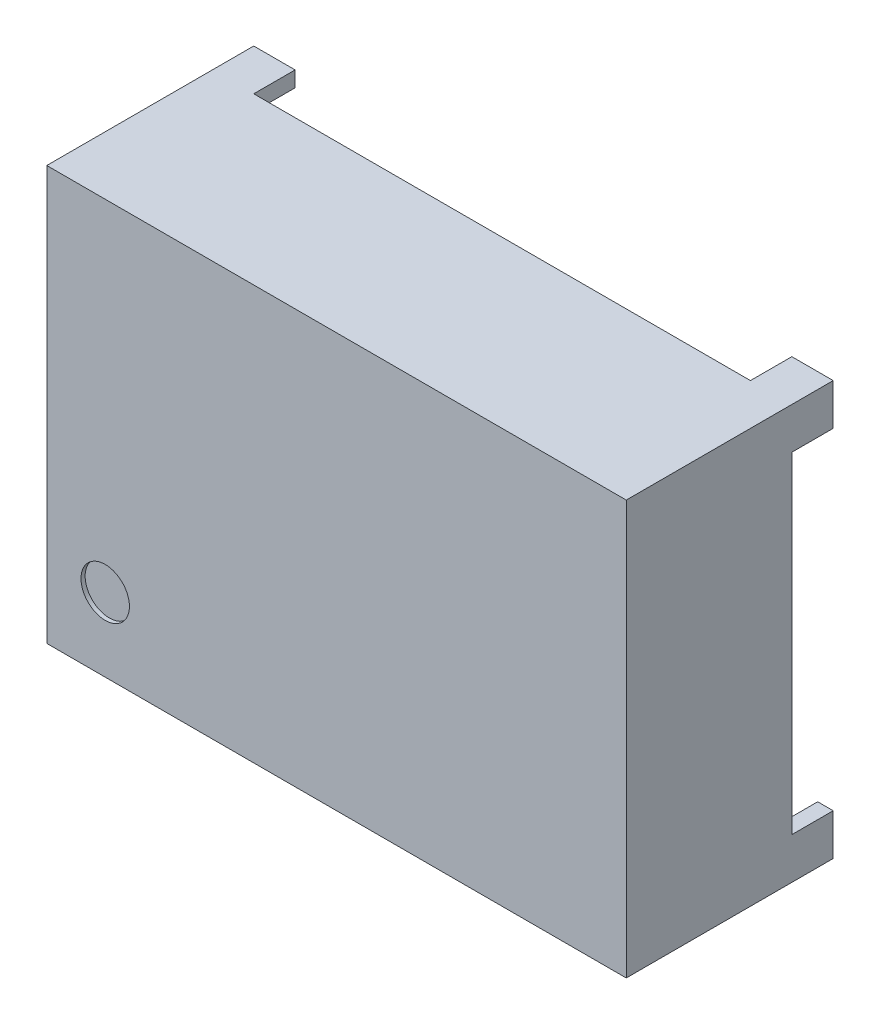
ISO-10303-21;
HEADER;
FILE_DESCRIPTION(('STEP AP214'),'2;1');
FILE_NAME('part.step','',(''),(''),'','','');
FILE_SCHEMA(('AUTOMOTIVE_DESIGN { 1 0 10303 214 1 1 1 1 }'));
ENDSEC;
DATA;
#1=APPLICATION_CONTEXT('core data for automotive mechanical design processes');
#2=APPLICATION_PROTOCOL_DEFINITION('international standard','automotive_design',2000,#1);
#3=PRODUCT_CONTEXT('',#1,'mechanical');
#4=PRODUCT('Part','Part','',(#3));
#5=PRODUCT_RELATED_PRODUCT_CATEGORY('part','',(#4));
#6=PRODUCT_DEFINITION_FORMATION('','',#4);
#7=PRODUCT_DEFINITION_CONTEXT('part definition',#1,'design');
#8=PRODUCT_DEFINITION('design','',#6,#7);
#9=PRODUCT_DEFINITION_SHAPE('','',#8);
#10=(LENGTH_UNIT() NAMED_UNIT(*) SI_UNIT(.MILLI.,.METRE.));
#11=(NAMED_UNIT(*) PLANE_ANGLE_UNIT() SI_UNIT($,.RADIAN.));
#12=(NAMED_UNIT(*) SI_UNIT($,.STERADIAN.) SOLID_ANGLE_UNIT());
#13=UNCERTAINTY_MEASURE_WITH_UNIT(LENGTH_MEASURE(1.E-05),#10,'distance_accuracy_value','');
#14=(GEOMETRIC_REPRESENTATION_CONTEXT(3) GLOBAL_UNCERTAINTY_ASSIGNED_CONTEXT((#13)) GLOBAL_UNIT_ASSIGNED_CONTEXT((#10,
#11,#12)) REPRESENTATION_CONTEXT('',''));
#15=CARTESIAN_POINT('',(0.,0.,0.));
#16=DIRECTION('',(0.,0.,1.));
#17=DIRECTION('',(1.,0.,0.));
#18=AXIS2_PLACEMENT_3D('',#15,#16,#17);
#19=CARTESIAN_POINT('',(-14.,-10.,0.));
#20=DIRECTION('',(0.,0.,1.));
#21=DIRECTION('',(1.,0.,0.));
#22=AXIS2_PLACEMENT_3D('',#19,#20,#21);
#23=PLANE('',#22);
#24=DIRECTION('',(1.,0.,0.));
#25=VECTOR('',#24,1.);
#26=CARTESIAN_POINT('',(-14.,-8.00000000000001,0.));
#27=LINE('',#26,#25);
#28=CARTESIAN_POINT('',(-14.,-8.00000000000001,0.));
#29=VERTEX_POINT('',#28);
#30=CARTESIAN_POINT('',(-13.25,-8.00000000000001,0.));
#31=VERTEX_POINT('',#30);
#32=EDGE_CURVE('E201',#29,#31,#27,.T.);
#33=ORIENTED_EDGE('',*,*,#32,.F.);
#34=DIRECTION('',(0.,-1.,0.));
#35=VECTOR('',#34,1.);
#36=CARTESIAN_POINT('',(-14.,10.,0.));
#37=LINE('',#36,#35);
#38=CARTESIAN_POINT('',(-14.,8.00000000000001,0.));
#39=VERTEX_POINT('',#38);
#40=EDGE_CURVE('E214',#39,#29,#37,.T.);
#41=ORIENTED_EDGE('',*,*,#40,.F.);
#42=DIRECTION('',(-1.,0.,0.));
#43=VECTOR('',#42,1.);
#44=CARTESIAN_POINT('',(-14.,8.00000000000001,0.));
#45=LINE('',#44,#43);
#46=CARTESIAN_POINT('',(-13.25,8.00000000000001,0.));
#47=VERTEX_POINT('',#46);
#48=EDGE_CURVE('E321',#47,#39,#45,.T.);
#49=ORIENTED_EDGE('',*,*,#48,.F.);
#50=DIRECTION('',(0.,-1.,0.));
#51=VECTOR('',#50,1.);
#52=CARTESIAN_POINT('',(-13.25,8.00000000000001,0.));
#53=LINE('',#52,#51);
#54=CARTESIAN_POINT('',(-13.25,9.25000000000001,0.));
#55=VERTEX_POINT('',#54);
#56=EDGE_CURVE('E323',#55,#47,#53,.T.);
#57=ORIENTED_EDGE('',*,*,#56,.F.);
#58=DIRECTION('',(-1.,0.,0.));
#59=VECTOR('',#58,1.);
#60=CARTESIAN_POINT('',(-13.25,9.25000000000001,0.));
#61=LINE('',#60,#59);
#62=CARTESIAN_POINT('',(-12.,9.25000000000001,0.));
#63=VERTEX_POINT('',#62);
#64=EDGE_CURVE('E325',#63,#55,#61,.T.);
#65=ORIENTED_EDGE('',*,*,#64,.F.);
#66=DIRECTION('',(0.,-1.,0.));
#67=VECTOR('',#66,1.);
#68=CARTESIAN_POINT('',(-12.,9.25000000000001,0.));
#69=LINE('',#68,#67);
#70=CARTESIAN_POINT('',(-12.,10.,0.));
#71=VERTEX_POINT('',#70);
#72=EDGE_CURVE('E327',#71,#63,#69,.T.);
#73=ORIENTED_EDGE('',*,*,#72,.F.);
#74=DIRECTION('',(-1.,0.,0.));
#75=VECTOR('',#74,1.);
#76=CARTESIAN_POINT('',(-14.,10.,0.));
#77=LINE('',#76,#75);
#78=CARTESIAN_POINT('',(12.,10.,0.));
#79=VERTEX_POINT('',#78);
#80=EDGE_CURVE('E239',#79,#71,#77,.T.);
#81=ORIENTED_EDGE('',*,*,#80,.F.);
#82=DIRECTION('',(0.,1.,0.));
#83=VECTOR('',#82,1.);
#84=CARTESIAN_POINT('',(12.,9.25000000000001,0.));
#85=LINE('',#84,#83);
#86=CARTESIAN_POINT('',(12.,9.25000000000001,0.));
#87=VERTEX_POINT('',#86);
#88=EDGE_CURVE('E252',#87,#79,#85,.T.);
#89=ORIENTED_EDGE('',*,*,#88,.F.);
#90=DIRECTION('',(-1.,0.,0.));
#91=VECTOR('',#90,1.);
#92=CARTESIAN_POINT('',(13.25,9.25000000000001,0.));
#93=LINE('',#92,#91);
#94=CARTESIAN_POINT('',(13.25,9.25000000000001,0.));
#95=VERTEX_POINT('',#94);
#96=EDGE_CURVE('E257',#95,#87,#93,.T.);
#97=ORIENTED_EDGE('',*,*,#96,.F.);
#98=DIRECTION('',(0.,1.,0.));
#99=VECTOR('',#98,1.);
#100=CARTESIAN_POINT('',(13.25,8.00000000000001,0.));
#101=LINE('',#100,#99);
#102=CARTESIAN_POINT('',(13.25,8.00000000000001,0.));
#103=VERTEX_POINT('',#102);
#104=EDGE_CURVE('E246',#103,#95,#101,.T.);
#105=ORIENTED_EDGE('',*,*,#104,.F.);
#106=DIRECTION('',(-1.,0.,0.));
#107=VECTOR('',#106,1.);
#108=CARTESIAN_POINT('',(14.,8.00000000000001,0.));
#109=LINE('',#108,#107);
#110=CARTESIAN_POINT('',(14.,8.00000000000001,0.));
#111=VERTEX_POINT('',#110);
#112=EDGE_CURVE('E243',#111,#103,#109,.T.);
#113=ORIENTED_EDGE('',*,*,#112,.F.);
#114=DIRECTION('',(0.,1.,0.));
#115=VECTOR('',#114,1.);
#116=CARTESIAN_POINT('',(14.,10.,0.));
#117=LINE('',#116,#115);
#118=CARTESIAN_POINT('',(14.,-8.00000000000001,0.));
#119=VERTEX_POINT('',#118);
#120=EDGE_CURVE('E36',#119,#111,#117,.T.);
#121=ORIENTED_EDGE('',*,*,#120,.F.);
#122=DIRECTION('',(1.,0.,0.));
#123=VECTOR('',#122,1.);
#124=CARTESIAN_POINT('',(14.,-8.00000000000001,0.));
#125=LINE('',#124,#123);
#126=CARTESIAN_POINT('',(13.25,-8.00000000000001,0.));
#127=VERTEX_POINT('',#126);
#128=EDGE_CURVE('E356',#127,#119,#125,.T.);
#129=ORIENTED_EDGE('',*,*,#128,.F.);
#130=DIRECTION('',(0.,1.,0.));
#131=VECTOR('',#130,1.);
#132=CARTESIAN_POINT('',(13.25,-8.00000000000001,0.));
#133=LINE('',#132,#131);
#134=CARTESIAN_POINT('',(13.25,-9.25000000000001,0.));
#135=VERTEX_POINT('',#134);
#136=EDGE_CURVE('E358',#135,#127,#133,.T.);
#137=ORIENTED_EDGE('',*,*,#136,.F.);
#138=DIRECTION('',(1.,0.,0.));
#139=VECTOR('',#138,1.);
#140=CARTESIAN_POINT('',(13.25,-9.25000000000001,0.));
#141=LINE('',#140,#139);
#142=CARTESIAN_POINT('',(12.,-9.25000000000001,0.));
#143=VERTEX_POINT('',#142);
#144=EDGE_CURVE('E360',#143,#135,#141,.T.);
#145=ORIENTED_EDGE('',*,*,#144,.F.);
#146=DIRECTION('',(0.,1.,0.));
#147=VECTOR('',#146,1.);
#148=CARTESIAN_POINT('',(12.,-9.25000000000001,0.));
#149=LINE('',#148,#147);
#150=CARTESIAN_POINT('',(12.,-10.,0.));
#151=VERTEX_POINT('',#150);
#152=EDGE_CURVE('E207',#151,#143,#149,.T.);
#153=ORIENTED_EDGE('',*,*,#152,.F.);
#154=DIRECTION('',(1.,0.,0.));
#155=VECTOR('',#154,1.);
#156=CARTESIAN_POINT('',(-14.,-10.,0.));
#157=LINE('',#156,#155);
#158=CARTESIAN_POINT('',(-12.,-10.,0.));
#159=VERTEX_POINT('',#158);
#160=EDGE_CURVE('E223',#159,#151,#157,.T.);
#161=ORIENTED_EDGE('',*,*,#160,.F.);
#162=DIRECTION('',(0.,-1.,0.));
#163=VECTOR('',#162,1.);
#164=CARTESIAN_POINT('',(-12.,-9.25000000000001,0.));
#165=LINE('',#164,#163);
#166=CARTESIAN_POINT('',(-12.,-9.25000000000001,0.));
#167=VERTEX_POINT('',#166);
#168=EDGE_CURVE('E384',#167,#159,#165,.T.);
#169=ORIENTED_EDGE('',*,*,#168,.F.);
#170=DIRECTION('',(1.,0.,0.));
#171=VECTOR('',#170,1.);
#172=CARTESIAN_POINT('',(-13.25,-9.25000000000001,0.));
#173=LINE('',#172,#171);
#174=CARTESIAN_POINT('',(-13.25,-9.25000000000001,0.));
#175=VERTEX_POINT('',#174);
#176=EDGE_CURVE('E386',#175,#167,#173,.T.);
#177=ORIENTED_EDGE('',*,*,#176,.F.);
#178=DIRECTION('',(0.,-1.,0.));
#179=VECTOR('',#178,1.);
#180=CARTESIAN_POINT('',(-13.25,-8.00000000000001,0.));
#181=LINE('',#180,#179);
#182=EDGE_CURVE('E216',#31,#175,#181,.T.);
#183=ORIENTED_EDGE('',*,*,#182,.F.);
#184=EDGE_LOOP('',(#33,#41,#49,#57,#65,#73,#81,#89,#97,#105,#113,#121,#129,#137,#145,#153,#161,
#169,#177,#183));
#185=FACE_BOUND('',#184,.T.);
#186=ADVANCED_FACE('F32',(#185),#23,.F.);
#187=CARTESIAN_POINT('',(-14.,10.,8.));
#188=DIRECTION('',(1.,0.,0.));
#189=DIRECTION('',(0.,0.,-1.));
#190=AXIS2_PLACEMENT_3D('',#187,#188,#189);
#191=PLANE('',#190);
#192=DIRECTION('',(0.,0.,-1.));
#193=VECTOR('',#192,1.);
#194=CARTESIAN_POINT('',(-14.,10.,8.));
#195=LINE('',#194,#193);
#196=CARTESIAN_POINT('',(-14.,10.,8.));
#197=VERTEX_POINT('',#196);
#198=CARTESIAN_POINT('',(-14.,10.,-2.));
#199=VERTEX_POINT('',#198);
#200=EDGE_CURVE('E417',#197,#199,#195,.T.);
#201=ORIENTED_EDGE('',*,*,#200,.T.);
#202=DIRECTION('',(0.,1.,0.));
#203=VECTOR('',#202,1.);
#204=CARTESIAN_POINT('',(-14.,10.,-2.));
#205=LINE('',#204,#203);
#206=CARTESIAN_POINT('',(-14.,8.00000000000001,-2.));
#207=VERTEX_POINT('',#206);
#208=EDGE_CURVE('E309',#207,#199,#205,.T.);
#209=ORIENTED_EDGE('',*,*,#208,.F.);
#210=DIRECTION('',(0.,0.,1.));
#211=VECTOR('',#210,1.);
#212=CARTESIAN_POINT('',(-14.,8.00000000000001,-2.));
#213=LINE('',#212,#211);
#214=EDGE_CURVE('E222',#207,#39,#213,.T.);
#215=ORIENTED_EDGE('',*,*,#214,.T.);
#216=ORIENTED_EDGE('',*,*,#40,.T.);
#217=DIRECTION('',(0.,0.,1.));
#218=VECTOR('',#217,1.);
#219=CARTESIAN_POINT('',(-14.,-8.00000000000001,-2.));
#220=LINE('',#219,#218);
#221=CARTESIAN_POINT('',(-14.,-8.00000000000001,-2.));
#222=VERTEX_POINT('',#221);
#223=EDGE_CURVE('E197',#222,#29,#220,.T.);
#224=ORIENTED_EDGE('',*,*,#223,.F.);
#225=DIRECTION('',(0.,1.,0.));
#226=VECTOR('',#225,1.);
#227=CARTESIAN_POINT('',(-14.,-10.,-2.));
#228=LINE('',#227,#226);
#229=CARTESIAN_POINT('',(-14.,-10.,-2.));
#230=VERTEX_POINT('',#229);
#231=EDGE_CURVE('E379',#230,#222,#228,.T.);
#232=ORIENTED_EDGE('',*,*,#231,.F.);
#233=DIRECTION('',(0.,0.,-1.));
#234=VECTOR('',#233,1.);
#235=CARTESIAN_POINT('',(-14.,-10.,8.));
#236=LINE('',#235,#234);
#237=CARTESIAN_POINT('',(-14.,-10.,8.));
#238=VERTEX_POINT('',#237);
#239=EDGE_CURVE('E11',#238,#230,#236,.T.);
#240=ORIENTED_EDGE('',*,*,#239,.F.);
#241=DIRECTION('',(0.,-1.,0.));
#242=VECTOR('',#241,1.);
#243=CARTESIAN_POINT('',(-14.,10.,8.));
#244=LINE('',#243,#242);
#245=EDGE_CURVE('E236',#197,#238,#244,.T.);
#246=ORIENTED_EDGE('',*,*,#245,.F.);
#247=EDGE_LOOP('',(#201,#209,#215,#216,#224,#232,#240,#246));
#248=FACE_BOUND('',#247,.T.);
#249=ADVANCED_FACE('F34',(#248),#191,.F.);
#250=CARTESIAN_POINT('',(-14.,-10.,8.));
#251=DIRECTION('',(0.,1.,0.));
#252=DIRECTION('',(-1.,0.,0.));
#253=AXIS2_PLACEMENT_3D('',#250,#251,#252);
#254=PLANE('',#253);
#255=ORIENTED_EDGE('',*,*,#239,.T.);
#256=DIRECTION('',(-1.,0.,0.));
#257=VECTOR('',#256,1.);
#258=CARTESIAN_POINT('',(-12.,-10.,-2.));
#259=LINE('',#258,#257);
#260=CARTESIAN_POINT('',(-12.,-10.,-2.));
#261=VERTEX_POINT('',#260);
#262=EDGE_CURVE('E381',#261,#230,#259,.T.);
#263=ORIENTED_EDGE('',*,*,#262,.F.);
#264=DIRECTION('',(0.,0.,1.));
#265=VECTOR('',#264,1.);
#266=CARTESIAN_POINT('',(-12.,-10.,-2.));
#267=LINE('',#266,#265);
#268=EDGE_CURVE('E50',#261,#159,#267,.T.);
#269=ORIENTED_EDGE('',*,*,#268,.T.);
#270=ORIENTED_EDGE('',*,*,#160,.T.);
#271=DIRECTION('',(0.,0.,1.));
#272=VECTOR('',#271,1.);
#273=CARTESIAN_POINT('',(12.,-10.,-2.));
#274=LINE('',#273,#272);
#275=CARTESIAN_POINT('',(12.,-10.,-2.));
#276=VERTEX_POINT('',#275);
#277=EDGE_CURVE('E339',#276,#151,#274,.T.);
#278=ORIENTED_EDGE('',*,*,#277,.F.);
#279=DIRECTION('',(-1.,0.,0.));
#280=VECTOR('',#279,1.);
#281=CARTESIAN_POINT('',(12.,-10.,-2.));
#282=LINE('',#281,#280);
#283=CARTESIAN_POINT('',(14.,-10.,-2.));
#284=VERTEX_POINT('',#283);
#285=EDGE_CURVE('E342',#284,#276,#282,.T.);
#286=ORIENTED_EDGE('',*,*,#285,.F.);
#287=DIRECTION('',(0.,0.,-1.));
#288=VECTOR('',#287,1.);
#289=CARTESIAN_POINT('',(14.,-10.,8.));
#290=LINE('',#289,#288);
#291=CARTESIAN_POINT('',(14.,-10.,8.));
#292=VERTEX_POINT('',#291);
#293=EDGE_CURVE('E42',#292,#284,#290,.T.);
#294=ORIENTED_EDGE('',*,*,#293,.F.);
#295=DIRECTION('',(1.,0.,0.));
#296=VECTOR('',#295,1.);
#297=CARTESIAN_POINT('',(-14.,-10.,8.));
#298=LINE('',#297,#296);
#299=EDGE_CURVE('E405',#238,#292,#298,.T.);
#300=ORIENTED_EDGE('',*,*,#299,.F.);
#301=EDGE_LOOP('',(#255,#263,#269,#270,#278,#286,#294,#300));
#302=FACE_BOUND('',#301,.T.);
#303=ADVANCED_FACE('F410',(#302),#254,.F.);
#304=CARTESIAN_POINT('',(14.,10.,8.));
#305=DIRECTION('',(-1.,0.,0.));
#306=DIRECTION('',(0.,0.,1.));
#307=AXIS2_PLACEMENT_3D('',#304,#305,#306);
#308=PLANE('',#307);
#309=ORIENTED_EDGE('',*,*,#293,.T.);
#310=DIRECTION('',(0.,-1.,0.));
#311=VECTOR('',#310,1.);
#312=CARTESIAN_POINT('',(14.,-10.,-2.));
#313=LINE('',#312,#311);
#314=CARTESIAN_POINT('',(14.,-8.00000000000001,-2.));
#315=VERTEX_POINT('',#314);
#316=EDGE_CURVE('E344',#315,#284,#313,.T.);
#317=ORIENTED_EDGE('',*,*,#316,.F.);
#318=DIRECTION('',(0.,0.,1.));
#319=VECTOR('',#318,1.);
#320=CARTESIAN_POINT('',(14.,-8.00000000000001,-2.));
#321=LINE('',#320,#319);
#322=EDGE_CURVE('E58',#315,#119,#321,.T.);
#323=ORIENTED_EDGE('',*,*,#322,.T.);
#324=ORIENTED_EDGE('',*,*,#120,.T.);
#325=DIRECTION('',(0.,0.,1.));
#326=VECTOR('',#325,1.);
#327=CARTESIAN_POINT('',(14.,8.00000000000001,-2.));
#328=LINE('',#327,#326);
#329=CARTESIAN_POINT('',(14.,8.00000000000001,-2.));
#330=VERTEX_POINT('',#329);
#331=EDGE_CURVE('E224',#330,#111,#328,.T.);
#332=ORIENTED_EDGE('',*,*,#331,.F.);
#333=DIRECTION('',(0.,-1.,0.));
#334=VECTOR('',#333,1.);
#335=CARTESIAN_POINT('',(14.,10.,-2.));
#336=LINE('',#335,#334);
#337=CARTESIAN_POINT('',(14.,10.,-2.));
#338=VERTEX_POINT('',#337);
#339=EDGE_CURVE('E265',#338,#330,#336,.T.);
#340=ORIENTED_EDGE('',*,*,#339,.F.);
#341=DIRECTION('',(0.,0.,-1.));
#342=VECTOR('',#341,1.);
#343=CARTESIAN_POINT('',(14.,10.,8.));
#344=LINE('',#343,#342);
#345=CARTESIAN_POINT('',(14.,10.,8.));
#346=VERTEX_POINT('',#345);
#347=EDGE_CURVE('E419',#346,#338,#344,.T.);
#348=ORIENTED_EDGE('',*,*,#347,.F.);
#349=DIRECTION('',(0.,1.,0.));
#350=VECTOR('',#349,1.);
#351=CARTESIAN_POINT('',(14.,10.,8.));
#352=LINE('',#351,#350);
#353=EDGE_CURVE('E413',#292,#346,#352,.T.);
#354=ORIENTED_EDGE('',*,*,#353,.F.);
#355=EDGE_LOOP('',(#309,#317,#323,#324,#332,#340,#348,#354));
#356=FACE_BOUND('',#355,.T.);
#357=ADVANCED_FACE('F420',(#356),#308,.F.);
#358=CARTESIAN_POINT('',(-14.,10.,8.));
#359=DIRECTION('',(0.,-1.,0.));
#360=DIRECTION('',(1.,0.,0.));
#361=AXIS2_PLACEMENT_3D('',#358,#359,#360);
#362=PLANE('',#361);
#363=ORIENTED_EDGE('',*,*,#347,.T.);
#364=DIRECTION('',(1.,0.,0.));
#365=VECTOR('',#364,1.);
#366=CARTESIAN_POINT('',(12.,10.,-2.));
#367=LINE('',#366,#365);
#368=CARTESIAN_POINT('',(12.,10.,-2.));
#369=VERTEX_POINT('',#368);
#370=EDGE_CURVE('E256',#369,#338,#367,.T.);
#371=ORIENTED_EDGE('',*,*,#370,.F.);
#372=DIRECTION('',(0.,0.,1.));
#373=VECTOR('',#372,1.);
#374=CARTESIAN_POINT('',(12.,10.,-2.));
#375=LINE('',#374,#373);
#376=EDGE_CURVE('E258',#369,#79,#375,.T.);
#377=ORIENTED_EDGE('',*,*,#376,.T.);
#378=ORIENTED_EDGE('',*,*,#80,.T.);
#379=DIRECTION('',(0.,0.,1.));
#380=VECTOR('',#379,1.);
#381=CARTESIAN_POINT('',(-12.,10.,-2.));
#382=LINE('',#381,#380);
#383=CARTESIAN_POINT('',(-12.,10.,-2.));
#384=VERTEX_POINT('',#383);
#385=EDGE_CURVE('E305',#384,#71,#382,.T.);
#386=ORIENTED_EDGE('',*,*,#385,.F.);
#387=DIRECTION('',(1.,0.,0.));
#388=VECTOR('',#387,1.);
#389=CARTESIAN_POINT('',(-12.,10.,-2.));
#390=LINE('',#389,#388);
#391=EDGE_CURVE('E307',#199,#384,#390,.T.);
#392=ORIENTED_EDGE('',*,*,#391,.F.);
#393=ORIENTED_EDGE('',*,*,#200,.F.);
#394=DIRECTION('',(-1.,0.,0.));
#395=VECTOR('',#394,1.);
#396=CARTESIAN_POINT('',(-14.,10.,8.));
#397=LINE('',#396,#395);
#398=EDGE_CURVE('E408',#346,#197,#397,.T.);
#399=ORIENTED_EDGE('',*,*,#398,.F.);
#400=EDGE_LOOP('',(#363,#371,#377,#378,#386,#392,#393,#399));
#401=FACE_BOUND('',#400,.T.);
#402=ADVANCED_FACE('F400',(#401),#362,.F.);
#403=CARTESIAN_POINT('',(-14.,-10.,8.));
#404=DIRECTION('',(0.,0.,1.));
#405=DIRECTION('',(1.,0.,0.));
#406=AXIS2_PLACEMENT_3D('',#403,#404,#405);
#407=PLANE('',#406);
#408=CARTESIAN_POINT('',(-11.1772695756427,-6.45347350435443,8.));
#409=DIRECTION('',(0.,0.,1.));
#410=DIRECTION('',(1.,0.,0.));
#411=AXIS2_PLACEMENT_3D('',#408,#409,#410);
#412=CIRCLE('',#411,1.17012038912152);
#413=CARTESIAN_POINT('',(-10.0071491865212,-6.45347350435443,8.));
#414=VERTEX_POINT('',#413);
#415=EDGE_CURVE('E391',#414,#414,#412,.T.);
#416=ORIENTED_EDGE('',*,*,#415,.F.);
#417=EDGE_LOOP('',(#416));
#418=FACE_BOUND('',#417,.T.);
#419=ORIENTED_EDGE('',*,*,#245,.T.);
#420=ORIENTED_EDGE('',*,*,#299,.T.);
#421=ORIENTED_EDGE('',*,*,#353,.T.);
#422=ORIENTED_EDGE('',*,*,#398,.T.);
#423=EDGE_LOOP('',(#419,#420,#421,#422));
#424=FACE_BOUND('',#423,.T.);
#425=ADVANCED_FACE('F397',(#418,#424),#407,.T.);
#426=CARTESIAN_POINT('',(14.,8.00000000000001,-2.));
#427=DIRECTION('',(0.,1.,0.));
#428=DIRECTION('',(0.,0.,1.));
#429=AXIS2_PLACEMENT_3D('',#426,#427,#428);
#430=PLANE('',#429);
#431=ORIENTED_EDGE('',*,*,#112,.T.);
#432=DIRECTION('',(0.,0.,1.));
#433=VECTOR('',#432,1.);
#434=CARTESIAN_POINT('',(13.25,8.00000000000001,-2.));
#435=LINE('',#434,#433);
#436=CARTESIAN_POINT('',(13.25,8.00000000000001,-2.));
#437=VERTEX_POINT('',#436);
#438=EDGE_CURVE('E228',#437,#103,#435,.T.);
#439=ORIENTED_EDGE('',*,*,#438,.F.);
#440=DIRECTION('',(-1.,0.,0.));
#441=VECTOR('',#440,1.);
#442=CARTESIAN_POINT('',(14.,8.00000000000001,-2.));
#443=LINE('',#442,#441);
#444=EDGE_CURVE('E267',#330,#437,#443,.T.);
#445=ORIENTED_EDGE('',*,*,#444,.F.);
#446=ORIENTED_EDGE('',*,*,#331,.T.);
#447=EDGE_LOOP('',(#431,#439,#445,#446));
#448=FACE_BOUND('',#447,.T.);
#449=ADVANCED_FACE('F291',(#448),#430,.F.);
#450=CARTESIAN_POINT('',(13.25,8.00000000000001,-2.));
#451=DIRECTION('',(1.,0.,0.));
#452=DIRECTION('',(0.,0.,-1.));
#453=AXIS2_PLACEMENT_3D('',#450,#451,#452);
#454=PLANE('',#453);
#455=ORIENTED_EDGE('',*,*,#104,.T.);
#456=DIRECTION('',(0.,0.,1.));
#457=VECTOR('',#456,1.);
#458=CARTESIAN_POINT('',(13.25,9.25000000000001,-2.));
#459=LINE('',#458,#457);
#460=CARTESIAN_POINT('',(13.25,9.25000000000001,-2.));
#461=VERTEX_POINT('',#460);
#462=EDGE_CURVE('E277',#461,#95,#459,.T.);
#463=ORIENTED_EDGE('',*,*,#462,.F.);
#464=DIRECTION('',(0.,1.,0.));
#465=VECTOR('',#464,1.);
#466=CARTESIAN_POINT('',(13.25,8.00000000000001,-2.));
#467=LINE('',#466,#465);
#468=EDGE_CURVE('E269',#437,#461,#467,.T.);
#469=ORIENTED_EDGE('',*,*,#468,.F.);
#470=ORIENTED_EDGE('',*,*,#438,.T.);
#471=EDGE_LOOP('',(#455,#463,#469,#470));
#472=FACE_BOUND('',#471,.T.);
#473=ADVANCED_FACE('F288',(#472),#454,.F.);
#474=CARTESIAN_POINT('',(13.25,9.25000000000001,-2.));
#475=DIRECTION('',(0.,1.,0.));
#476=DIRECTION('',(0.,0.,1.));
#477=AXIS2_PLACEMENT_3D('',#474,#475,#476);
#478=PLANE('',#477);
#479=ORIENTED_EDGE('',*,*,#96,.T.);
#480=DIRECTION('',(0.,0.,1.));
#481=VECTOR('',#480,1.);
#482=CARTESIAN_POINT('',(12.,9.25000000000001,-2.));
#483=LINE('',#482,#481);
#484=CARTESIAN_POINT('',(12.,9.25000000000001,-2.));
#485=VERTEX_POINT('',#484);
#486=EDGE_CURVE('E275',#485,#87,#483,.T.);
#487=ORIENTED_EDGE('',*,*,#486,.F.);
#488=DIRECTION('',(-1.,0.,0.));
#489=VECTOR('',#488,1.);
#490=CARTESIAN_POINT('',(13.25,9.25000000000001,-2.));
#491=LINE('',#490,#489);
#492=EDGE_CURVE('E271',#461,#485,#491,.T.);
#493=ORIENTED_EDGE('',*,*,#492,.F.);
#494=ORIENTED_EDGE('',*,*,#462,.T.);
#495=EDGE_LOOP('',(#479,#487,#493,#494));
#496=FACE_BOUND('',#495,.T.);
#497=ADVANCED_FACE('F508',(#496),#478,.F.);
#498=CARTESIAN_POINT('',(12.,9.25000000000001,-2.));
#499=DIRECTION('',(1.,0.,0.));
#500=DIRECTION('',(0.,0.,-1.));
#501=AXIS2_PLACEMENT_3D('',#498,#499,#500);
#502=PLANE('',#501);
#503=ORIENTED_EDGE('',*,*,#88,.T.);
#504=ORIENTED_EDGE('',*,*,#376,.F.);
#505=DIRECTION('',(0.,1.,0.));
#506=VECTOR('',#505,1.);
#507=CARTESIAN_POINT('',(12.,9.25000000000001,-2.));
#508=LINE('',#507,#506);
#509=EDGE_CURVE('E273',#485,#369,#508,.T.);
#510=ORIENTED_EDGE('',*,*,#509,.F.);
#511=ORIENTED_EDGE('',*,*,#486,.T.);
#512=EDGE_LOOP('',(#503,#504,#510,#511));
#513=FACE_BOUND('',#512,.T.);
#514=ADVANCED_FACE('F514',(#513),#502,.F.);
#515=CARTESIAN_POINT('',(14.,10.,-2.));
#516=DIRECTION('',(0.,0.,-1.));
#517=DIRECTION('',(-1.,0.,0.));
#518=AXIS2_PLACEMENT_3D('',#515,#516,#517);
#519=PLANE('',#518);
#520=ORIENTED_EDGE('',*,*,#370,.T.);
#521=ORIENTED_EDGE('',*,*,#339,.T.);
#522=ORIENTED_EDGE('',*,*,#444,.T.);
#523=ORIENTED_EDGE('',*,*,#468,.T.);
#524=ORIENTED_EDGE('',*,*,#492,.T.);
#525=ORIENTED_EDGE('',*,*,#509,.T.);
#526=EDGE_LOOP('',(#520,#521,#522,#523,#524,#525));
#527=FACE_BOUND('',#526,.T.);
#528=ADVANCED_FACE('F521',(#527),#519,.T.);
#529=CARTESIAN_POINT('',(-12.,9.25000000000001,-2.));
#530=DIRECTION('',(-1.,0.,0.));
#531=DIRECTION('',(0.,0.,1.));
#532=AXIS2_PLACEMENT_3D('',#529,#530,#531);
#533=PLANE('',#532);
#534=ORIENTED_EDGE('',*,*,#72,.T.);
#535=DIRECTION('',(0.,0.,1.));
#536=VECTOR('',#535,1.);
#537=CARTESIAN_POINT('',(-12.,9.25000000000001,-2.));
#538=LINE('',#537,#536);
#539=CARTESIAN_POINT('',(-12.,9.25000000000001,-2.));
#540=VERTEX_POINT('',#539);
#541=EDGE_CURVE('E247',#540,#63,#538,.T.);
#542=ORIENTED_EDGE('',*,*,#541,.F.);
#543=DIRECTION('',(0.,-1.,0.));
#544=VECTOR('',#543,1.);
#545=CARTESIAN_POINT('',(-12.,9.25000000000001,-2.));
#546=LINE('',#545,#544);
#547=EDGE_CURVE('E318',#384,#540,#546,.T.);
#548=ORIENTED_EDGE('',*,*,#547,.F.);
#549=ORIENTED_EDGE('',*,*,#385,.T.);
#550=EDGE_LOOP('',(#534,#542,#548,#549));
#551=FACE_BOUND('',#550,.T.);
#552=ADVANCED_FACE('F529',(#551),#533,.F.);
#553=CARTESIAN_POINT('',(-13.25,9.25000000000001,-2.));
#554=DIRECTION('',(0.,1.,0.));
#555=DIRECTION('',(0.,0.,1.));
#556=AXIS2_PLACEMENT_3D('',#553,#554,#555);
#557=PLANE('',#556);
#558=ORIENTED_EDGE('',*,*,#64,.T.);
#559=DIRECTION('',(0.,0.,1.));
#560=VECTOR('',#559,1.);
#561=CARTESIAN_POINT('',(-13.25,9.25000000000001,-2.));
#562=LINE('',#561,#560);
#563=CARTESIAN_POINT('',(-13.25,9.25000000000001,-2.));
#564=VERTEX_POINT('',#563);
#565=EDGE_CURVE('E298',#564,#55,#562,.T.);
#566=ORIENTED_EDGE('',*,*,#565,.F.);
#567=DIRECTION('',(-1.,0.,0.));
#568=VECTOR('',#567,1.);
#569=CARTESIAN_POINT('',(-13.25,9.25000000000001,-2.));
#570=LINE('',#569,#568);
#571=EDGE_CURVE('E316',#540,#564,#570,.T.);
#572=ORIENTED_EDGE('',*,*,#571,.F.);
#573=ORIENTED_EDGE('',*,*,#541,.T.);
#574=EDGE_LOOP('',(#558,#566,#572,#573));
#575=FACE_BOUND('',#574,.T.);
#576=ADVANCED_FACE('F537',(#575),#557,.F.);
#577=CARTESIAN_POINT('',(-13.25,8.00000000000001,-2.));
#578=DIRECTION('',(-1.,0.,0.));
#579=DIRECTION('',(0.,0.,1.));
#580=AXIS2_PLACEMENT_3D('',#577,#578,#579);
#581=PLANE('',#580);
#582=ORIENTED_EDGE('',*,*,#56,.T.);
#583=DIRECTION('',(0.,0.,1.));
#584=VECTOR('',#583,1.);
#585=CARTESIAN_POINT('',(-13.25,8.00000000000001,-2.));
#586=LINE('',#585,#584);
#587=CARTESIAN_POINT('',(-13.25,8.00000000000001,-2.));
#588=VERTEX_POINT('',#587);
#589=EDGE_CURVE('E301',#588,#47,#586,.T.);
#590=ORIENTED_EDGE('',*,*,#589,.F.);
#591=DIRECTION('',(0.,-1.,0.));
#592=VECTOR('',#591,1.);
#593=CARTESIAN_POINT('',(-13.25,8.00000000000001,-2.));
#594=LINE('',#593,#592);
#595=EDGE_CURVE('E314',#564,#588,#594,.T.);
#596=ORIENTED_EDGE('',*,*,#595,.F.);
#597=ORIENTED_EDGE('',*,*,#565,.T.);
#598=EDGE_LOOP('',(#582,#590,#596,#597));
#599=FACE_BOUND('',#598,.T.);
#600=ADVANCED_FACE('F545',(#599),#581,.F.);
#601=CARTESIAN_POINT('',(-14.,8.00000000000001,-2.));
#602=DIRECTION('',(0.,1.,0.));
#603=DIRECTION('',(0.,0.,1.));
#604=AXIS2_PLACEMENT_3D('',#601,#602,#603);
#605=PLANE('',#604);
#606=ORIENTED_EDGE('',*,*,#48,.T.);
#607=ORIENTED_EDGE('',*,*,#214,.F.);
#608=DIRECTION('',(-1.,0.,0.));
#609=VECTOR('',#608,1.);
#610=CARTESIAN_POINT('',(-14.,8.00000000000001,-2.));
#611=LINE('',#610,#609);
#612=EDGE_CURVE('E312',#588,#207,#611,.T.);
#613=ORIENTED_EDGE('',*,*,#612,.F.);
#614=ORIENTED_EDGE('',*,*,#589,.T.);
#615=EDGE_LOOP('',(#606,#607,#613,#614));
#616=FACE_BOUND('',#615,.T.);
#617=ADVANCED_FACE('F553',(#616),#605,.F.);
#618=CARTESIAN_POINT('',(-12.,10.,-2.));
#619=DIRECTION('',(0.,0.,1.));
#620=DIRECTION('',(1.,0.,0.));
#621=AXIS2_PLACEMENT_3D('',#618,#619,#620);
#622=PLANE('',#621);
#623=ORIENTED_EDGE('',*,*,#547,.T.);
#624=ORIENTED_EDGE('',*,*,#571,.T.);
#625=ORIENTED_EDGE('',*,*,#595,.T.);
#626=ORIENTED_EDGE('',*,*,#612,.T.);
#627=ORIENTED_EDGE('',*,*,#208,.T.);
#628=ORIENTED_EDGE('',*,*,#391,.T.);
#629=EDGE_LOOP('',(#623,#624,#625,#626,#627,#628));
#630=FACE_BOUND('',#629,.T.);
#631=ADVANCED_FACE('F561',(#630),#622,.F.);
#632=CARTESIAN_POINT('',(12.,-9.25000000000001,-2.));
#633=DIRECTION('',(1.,0.,0.));
#634=DIRECTION('',(0.,0.,-1.));
#635=AXIS2_PLACEMENT_3D('',#632,#633,#634);
#636=PLANE('',#635);
#637=ORIENTED_EDGE('',*,*,#152,.T.);
#638=DIRECTION('',(0.,0.,1.));
#639=VECTOR('',#638,1.);
#640=CARTESIAN_POINT('',(12.,-9.25000000000001,-2.));
#641=LINE('',#640,#639);
#642=CARTESIAN_POINT('',(12.,-9.25000000000001,-2.));
#643=VERTEX_POINT('',#642);
#644=EDGE_CURVE('E330',#643,#143,#641,.T.);
#645=ORIENTED_EDGE('',*,*,#644,.F.);
#646=DIRECTION('',(0.,1.,0.));
#647=VECTOR('',#646,1.);
#648=CARTESIAN_POINT('',(12.,-9.25000000000001,-2.));
#649=LINE('',#648,#647);
#650=EDGE_CURVE('E353',#276,#643,#649,.T.);
#651=ORIENTED_EDGE('',*,*,#650,.F.);
#652=ORIENTED_EDGE('',*,*,#277,.T.);
#653=EDGE_LOOP('',(#637,#645,#651,#652));
#654=FACE_BOUND('',#653,.T.);
#655=ADVANCED_FACE('F431',(#654),#636,.F.);
#656=CARTESIAN_POINT('',(13.25,-9.25000000000001,-2.));
#657=DIRECTION('',(0.,-1.,0.));
#658=DIRECTION('',(0.,0.,-1.));
#659=AXIS2_PLACEMENT_3D('',#656,#657,#658);
#660=PLANE('',#659);
#661=ORIENTED_EDGE('',*,*,#144,.T.);
#662=DIRECTION('',(0.,0.,1.));
#663=VECTOR('',#662,1.);
#664=CARTESIAN_POINT('',(13.25,-9.25000000000001,-2.));
#665=LINE('',#664,#663);
#666=CARTESIAN_POINT('',(13.25,-9.25000000000001,-2.));
#667=VERTEX_POINT('',#666);
#668=EDGE_CURVE('E332',#667,#135,#665,.T.);
#669=ORIENTED_EDGE('',*,*,#668,.F.);
#670=DIRECTION('',(1.,0.,0.));
#671=VECTOR('',#670,1.);
#672=CARTESIAN_POINT('',(13.25,-9.25000000000001,-2.));
#673=LINE('',#672,#671);
#674=EDGE_CURVE('E351',#643,#667,#673,.T.);
#675=ORIENTED_EDGE('',*,*,#674,.F.);
#676=ORIENTED_EDGE('',*,*,#644,.T.);
#677=EDGE_LOOP('',(#661,#669,#675,#676));
#678=FACE_BOUND('',#677,.T.);
#679=ADVANCED_FACE('F436',(#678),#660,.F.);
#680=CARTESIAN_POINT('',(13.25,-8.00000000000001,-2.));
#681=DIRECTION('',(1.,0.,0.));
#682=DIRECTION('',(0.,0.,-1.));
#683=AXIS2_PLACEMENT_3D('',#680,#681,#682);
#684=PLANE('',#683);
#685=ORIENTED_EDGE('',*,*,#136,.T.);
#686=DIRECTION('',(0.,0.,1.));
#687=VECTOR('',#686,1.);
#688=CARTESIAN_POINT('',(13.25,-8.00000000000001,-2.));
#689=LINE('',#688,#687);
#690=CARTESIAN_POINT('',(13.25,-8.00000000000001,-2.));
#691=VERTEX_POINT('',#690);
#692=EDGE_CURVE('E335',#691,#127,#689,.T.);
#693=ORIENTED_EDGE('',*,*,#692,.F.);
#694=DIRECTION('',(0.,1.,0.));
#695=VECTOR('',#694,1.);
#696=CARTESIAN_POINT('',(13.25,-8.00000000000001,-2.));
#697=LINE('',#696,#695);
#698=EDGE_CURVE('E349',#667,#691,#697,.T.);
#699=ORIENTED_EDGE('',*,*,#698,.F.);
#700=ORIENTED_EDGE('',*,*,#668,.T.);
#701=EDGE_LOOP('',(#685,#693,#699,#700));
#702=FACE_BOUND('',#701,.T.);
#703=ADVANCED_FACE('F440',(#702),#684,.F.);
#704=CARTESIAN_POINT('',(14.,-8.00000000000001,-2.));
#705=DIRECTION('',(0.,-1.,0.));
#706=DIRECTION('',(0.,0.,-1.));
#707=AXIS2_PLACEMENT_3D('',#704,#705,#706);
#708=PLANE('',#707);
#709=ORIENTED_EDGE('',*,*,#128,.T.);
#710=ORIENTED_EDGE('',*,*,#322,.F.);
#711=DIRECTION('',(1.,0.,0.));
#712=VECTOR('',#711,1.);
#713=CARTESIAN_POINT('',(14.,-8.00000000000001,-2.));
#714=LINE('',#713,#712);
#715=EDGE_CURVE('E347',#691,#315,#714,.T.);
#716=ORIENTED_EDGE('',*,*,#715,.F.);
#717=ORIENTED_EDGE('',*,*,#692,.T.);
#718=EDGE_LOOP('',(#709,#710,#716,#717));
#719=FACE_BOUND('',#718,.T.);
#720=ADVANCED_FACE('F442',(#719),#708,.F.);
#721=CARTESIAN_POINT('',(12.,-10.,-2.));
#722=DIRECTION('',(0.,0.,1.));
#723=DIRECTION('',(1.,0.,0.));
#724=AXIS2_PLACEMENT_3D('',#721,#722,#723);
#725=PLANE('',#724);
#726=ORIENTED_EDGE('',*,*,#650,.T.);
#727=ORIENTED_EDGE('',*,*,#674,.T.);
#728=ORIENTED_EDGE('',*,*,#698,.T.);
#729=ORIENTED_EDGE('',*,*,#715,.T.);
#730=ORIENTED_EDGE('',*,*,#316,.T.);
#731=ORIENTED_EDGE('',*,*,#285,.T.);
#732=EDGE_LOOP('',(#726,#727,#728,#729,#730,#731));
#733=FACE_BOUND('',#732,.T.);
#734=ADVANCED_FACE('F423',(#733),#725,.F.);
#735=CARTESIAN_POINT('',(-14.,-8.00000000000001,-2.));
#736=DIRECTION('',(0.,-1.,0.));
#737=DIRECTION('',(0.,0.,-1.));
#738=AXIS2_PLACEMENT_3D('',#735,#736,#737);
#739=PLANE('',#738);
#740=ORIENTED_EDGE('',*,*,#32,.T.);
#741=DIRECTION('',(0.,0.,1.));
#742=VECTOR('',#741,1.);
#743=CARTESIAN_POINT('',(-13.25,-8.00000000000001,-2.));
#744=LINE('',#743,#742);
#745=CARTESIAN_POINT('',(-13.25,-8.00000000000001,-2.));
#746=VERTEX_POINT('',#745);
#747=EDGE_CURVE('E208',#746,#31,#744,.T.);
#748=ORIENTED_EDGE('',*,*,#747,.F.);
#749=DIRECTION('',(1.,0.,0.));
#750=VECTOR('',#749,1.);
#751=CARTESIAN_POINT('',(-14.,-8.00000000000001,-2.));
#752=LINE('',#751,#750);
#753=EDGE_CURVE('E203',#222,#746,#752,.T.);
#754=ORIENTED_EDGE('',*,*,#753,.F.);
#755=ORIENTED_EDGE('',*,*,#223,.T.);
#756=EDGE_LOOP('',(#740,#748,#754,#755));
#757=FACE_BOUND('',#756,.T.);
#758=ADVANCED_FACE('F199',(#757),#739,.F.);
#759=CARTESIAN_POINT('',(-13.25,-8.00000000000001,-2.));
#760=DIRECTION('',(-1.,0.,0.));
#761=DIRECTION('',(0.,0.,1.));
#762=AXIS2_PLACEMENT_3D('',#759,#760,#761);
#763=PLANE('',#762);
#764=ORIENTED_EDGE('',*,*,#182,.T.);
#765=DIRECTION('',(0.,0.,1.));
#766=VECTOR('',#765,1.);
#767=CARTESIAN_POINT('',(-13.25,-9.25000000000001,-2.));
#768=LINE('',#767,#766);
#769=CARTESIAN_POINT('',(-13.25,-9.25000000000001,-2.));
#770=VERTEX_POINT('',#769);
#771=EDGE_CURVE('E365',#770,#175,#768,.T.);
#772=ORIENTED_EDGE('',*,*,#771,.F.);
#773=DIRECTION('',(0.,-1.,0.));
#774=VECTOR('',#773,1.);
#775=CARTESIAN_POINT('',(-13.25,-8.00000000000001,-2.));
#776=LINE('',#775,#774);
#777=EDGE_CURVE('E376',#746,#770,#776,.T.);
#778=ORIENTED_EDGE('',*,*,#777,.F.);
#779=ORIENTED_EDGE('',*,*,#747,.T.);
#780=EDGE_LOOP('',(#764,#772,#778,#779));
#781=FACE_BOUND('',#780,.T.);
#782=ADVANCED_FACE('F454',(#781),#763,.F.);
#783=CARTESIAN_POINT('',(-13.25,-9.25000000000001,-2.));
#784=DIRECTION('',(0.,-1.,0.));
#785=DIRECTION('',(0.,0.,-1.));
#786=AXIS2_PLACEMENT_3D('',#783,#784,#785);
#787=PLANE('',#786);
#788=ORIENTED_EDGE('',*,*,#176,.T.);
#789=DIRECTION('',(0.,0.,1.));
#790=VECTOR('',#789,1.);
#791=CARTESIAN_POINT('',(-12.,-9.25000000000001,-2.));
#792=LINE('',#791,#790);
#793=CARTESIAN_POINT('',(-12.,-9.25000000000001,-2.));
#794=VERTEX_POINT('',#793);
#795=EDGE_CURVE('E368',#794,#167,#792,.T.);
#796=ORIENTED_EDGE('',*,*,#795,.F.);
#797=DIRECTION('',(1.,0.,0.));
#798=VECTOR('',#797,1.);
#799=CARTESIAN_POINT('',(-13.25,-9.25000000000001,-2.));
#800=LINE('',#799,#798);
#801=EDGE_CURVE('E374',#770,#794,#800,.T.);
#802=ORIENTED_EDGE('',*,*,#801,.F.);
#803=ORIENTED_EDGE('',*,*,#771,.T.);
#804=EDGE_LOOP('',(#788,#796,#802,#803));
#805=FACE_BOUND('',#804,.T.);
#806=ADVANCED_FACE('F450',(#805),#787,.F.);
#807=CARTESIAN_POINT('',(-12.,-9.25000000000001,-2.));
#808=DIRECTION('',(-1.,0.,0.));
#809=DIRECTION('',(0.,0.,1.));
#810=AXIS2_PLACEMENT_3D('',#807,#808,#809);
#811=PLANE('',#810);
#812=ORIENTED_EDGE('',*,*,#168,.T.);
#813=ORIENTED_EDGE('',*,*,#268,.F.);
#814=DIRECTION('',(0.,-1.,0.));
#815=VECTOR('',#814,1.);
#816=CARTESIAN_POINT('',(-12.,-9.25000000000001,-2.));
#817=LINE('',#816,#815);
#818=EDGE_CURVE('E372',#794,#261,#817,.T.);
#819=ORIENTED_EDGE('',*,*,#818,.F.);
#820=ORIENTED_EDGE('',*,*,#795,.T.);
#821=EDGE_LOOP('',(#812,#813,#819,#820));
#822=FACE_BOUND('',#821,.T.);
#823=ADVANCED_FACE('F445',(#822),#811,.F.);
#824=CARTESIAN_POINT('',(-14.,-10.,-2.));
#825=DIRECTION('',(0.,0.,-1.));
#826=DIRECTION('',(-1.,0.,0.));
#827=AXIS2_PLACEMENT_3D('',#824,#825,#826);
#828=PLANE('',#827);
#829=ORIENTED_EDGE('',*,*,#262,.T.);
#830=ORIENTED_EDGE('',*,*,#231,.T.);
#831=ORIENTED_EDGE('',*,*,#753,.T.);
#832=ORIENTED_EDGE('',*,*,#777,.T.);
#833=ORIENTED_EDGE('',*,*,#801,.T.);
#834=ORIENTED_EDGE('',*,*,#818,.T.);
#835=EDGE_LOOP('',(#829,#830,#831,#832,#833,#834));
#836=FACE_BOUND('',#835,.T.);
#837=ADVANCED_FACE('F456',(#836),#828,.T.);
#838=CARTESIAN_POINT('',(-11.1772695756427,-6.45347350435443,7.8));
#839=DIRECTION('',(0.,0.,1.));
#840=DIRECTION('',(1.,0.,0.));
#841=AXIS2_PLACEMENT_3D('',#838,#839,#840);
#842=CYLINDRICAL_SURFACE('',#841,1.17012038912152);
#843=CARTESIAN_POINT('',(-11.1772695756427,-6.45347350435443,7.8));
#844=DIRECTION('',(0.,0.,1.));
#845=DIRECTION('',(1.,0.,0.));
#846=AXIS2_PLACEMENT_3D('',#843,#844,#845);
#847=CIRCLE('',#846,1.17012038912152);
#848=CARTESIAN_POINT('',(-10.0071491865212,-6.45347350435443,7.8));
#849=VERTEX_POINT('',#848);
#850=EDGE_CURVE('E217',#849,#849,#847,.T.);
#851=ORIENTED_EDGE('',*,*,#850,.F.);
#852=EDGE_LOOP('',(#851));
#853=FACE_BOUND('',#852,.T.);
#854=ORIENTED_EDGE('',*,*,#415,.T.);
#855=EDGE_LOOP('',(#854));
#856=FACE_BOUND('',#855,.T.);
#857=ADVANCED_FACE('F395',(#853,#856),#842,.F.);
#858=CARTESIAN_POINT('',(-11.1772695756427,-6.45347350435443,7.8));
#859=DIRECTION('',(0.,0.,1.));
#860=DIRECTION('',(1.,0.,0.));
#861=AXIS2_PLACEMENT_3D('',#858,#859,#860);
#862=PLANE('',#861);
#863=ORIENTED_EDGE('',*,*,#850,.T.);
#864=EDGE_LOOP('',(#863));
#865=FACE_BOUND('',#864,.T.);
#866=ADVANCED_FACE('F463',(#865),#862,.T.);
#867=CLOSED_SHELL('',(#186,#249,#303,#357,#402,#425,#449,#473,#497,#514,#528,#552,#576,#600,
#617,#631,#655,#679,#703,#720,#734,#758,#782,#806,#823,#837,#857,#866));
#868=MANIFOLD_SOLID_BREP('B2',#867);
#869=ADVANCED_BREP_SHAPE_REPRESENTATION('',(#18,#868),#14);
#870=SHAPE_DEFINITION_REPRESENTATION(#9,#869);
ENDSEC;
END-ISO-10303-21;
